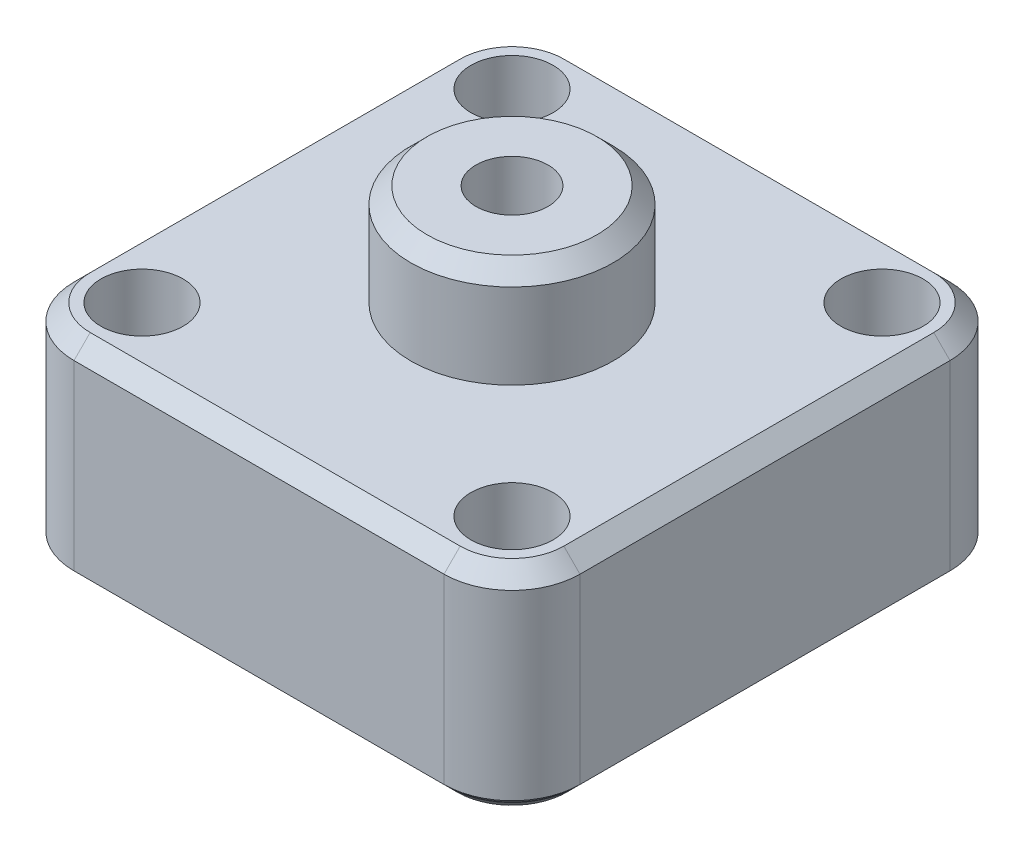
ISO-10303-21;
HEADER;
FILE_DESCRIPTION(('STEP AP214'),'2;1');
FILE_NAME('part.step','',(''),(''),'','','');
FILE_SCHEMA(('AUTOMOTIVE_DESIGN { 1 0 10303 214 1 1 1 1 }'));
ENDSEC;
DATA;
#1=APPLICATION_CONTEXT('core data for automotive mechanical design processes');
#2=APPLICATION_PROTOCOL_DEFINITION('international standard','automotive_design',2000,#1);
#3=PRODUCT_CONTEXT('',#1,'mechanical');
#4=PRODUCT('Part','Part','',(#3));
#5=PRODUCT_RELATED_PRODUCT_CATEGORY('part','',(#4));
#6=PRODUCT_DEFINITION_FORMATION('','',#4);
#7=PRODUCT_DEFINITION_CONTEXT('part definition',#1,'design');
#8=PRODUCT_DEFINITION('design','',#6,#7);
#9=PRODUCT_DEFINITION_SHAPE('','',#8);
#10=(LENGTH_UNIT() NAMED_UNIT(*) SI_UNIT(.MILLI.,.METRE.));
#11=(NAMED_UNIT(*) PLANE_ANGLE_UNIT() SI_UNIT($,.RADIAN.));
#12=(NAMED_UNIT(*) SI_UNIT($,.STERADIAN.) SOLID_ANGLE_UNIT());
#13=UNCERTAINTY_MEASURE_WITH_UNIT(LENGTH_MEASURE(1.E-05),#10,'distance_accuracy_value','');
#14=(GEOMETRIC_REPRESENTATION_CONTEXT(3) GLOBAL_UNCERTAINTY_ASSIGNED_CONTEXT((#13)) GLOBAL_UNIT_ASSIGNED_CONTEXT((#10,
#11,#12)) REPRESENTATION_CONTEXT('',''));
#15=CARTESIAN_POINT('',(0.,0.,0.));
#16=DIRECTION('',(0.,0.,1.));
#17=DIRECTION('',(1.,0.,0.));
#18=AXIS2_PLACEMENT_3D('',#15,#16,#17);
#19=CARTESIAN_POINT('',(7.93749999999999,9.525,-7.9375));
#20=DIRECTION('',(-1.,0.,0.));
#21=DIRECTION('',(0.,0.,1.));
#22=AXIS2_PLACEMENT_3D('',#19,#20,#21);
#23=PLANE('',#22);
#24=DIRECTION('',(0.,-1.,0.));
#25=VECTOR('',#24,1.);
#26=CARTESIAN_POINT('',(7.9375,9.525,5.8039));
#27=LINE('',#26,#25);
#28=CARTESIAN_POINT('',(7.9375,5.842,5.8039));
#29=VERTEX_POINT('',#28);
#30=CARTESIAN_POINT('',(7.9375,0.127000000000002,5.8039));
#31=VERTEX_POINT('',#30);
#32=EDGE_CURVE('E391',#29,#31,#27,.T.);
#33=ORIENTED_EDGE('',*,*,#32,.T.);
#34=DIRECTION('',(0.,0.,-1.));
#35=VECTOR('',#34,1.);
#36=CARTESIAN_POINT('',(7.93749999999999,0.126999999999999,-7.9375));
#37=LINE('',#36,#35);
#38=CARTESIAN_POINT('',(7.9375,0.127000000000002,-5.8039));
#39=VERTEX_POINT('',#38);
#40=EDGE_CURVE('E13',#31,#39,#37,.T.);
#41=ORIENTED_EDGE('',*,*,#40,.T.);
#42=DIRECTION('',(0.,-1.,0.));
#43=VECTOR('',#42,1.);
#44=CARTESIAN_POINT('',(7.9375,9.525,-5.8039));
#45=LINE('',#44,#43);
#46=CARTESIAN_POINT('',(7.9375,5.842,-5.8039));
#47=VERTEX_POINT('',#46);
#48=EDGE_CURVE('E389',#47,#39,#45,.T.);
#49=ORIENTED_EDGE('',*,*,#48,.F.);
#50=DIRECTION('',(0.,0.,1.));
#51=VECTOR('',#50,1.);
#52=CARTESIAN_POINT('',(7.9375,5.842,5.8039));
#53=LINE('',#52,#51);
#54=EDGE_CURVE('E385',#47,#29,#53,.T.);
#55=ORIENTED_EDGE('',*,*,#54,.T.);
#56=EDGE_LOOP('',(#33,#41,#49,#55));
#57=FACE_BOUND('',#56,.T.);
#58=ADVANCED_FACE('F44',(#57),#23,.F.);
#59=CARTESIAN_POINT('',(-7.93750000000001,9.525,-7.9375));
#60=DIRECTION('',(0.,0.,1.));
#61=DIRECTION('',(1.,0.,0.));
#62=AXIS2_PLACEMENT_3D('',#59,#60,#61);
#63=PLANE('',#62);
#64=DIRECTION('',(0.,-1.,0.));
#65=VECTOR('',#64,1.);
#66=CARTESIAN_POINT('',(5.8039,9.525,-7.9375));
#67=LINE('',#66,#65);
#68=CARTESIAN_POINT('',(5.8039,5.842,-7.9375));
#69=VERTEX_POINT('',#68);
#70=CARTESIAN_POINT('',(5.8039,0.127000000000002,-7.9375));
#71=VERTEX_POINT('',#70);
#72=EDGE_CURVE('E308',#69,#71,#67,.T.);
#73=ORIENTED_EDGE('',*,*,#72,.T.);
#74=DIRECTION('',(-1.,0.,0.));
#75=VECTOR('',#74,1.);
#76=CARTESIAN_POINT('',(-7.93750000000001,0.126999999999999,-7.9375));
#77=LINE('',#76,#75);
#78=CARTESIAN_POINT('',(-5.8039,0.127000000000002,-7.9375));
#79=VERTEX_POINT('',#78);
#80=EDGE_CURVE('E225',#71,#79,#77,.T.);
#81=ORIENTED_EDGE('',*,*,#80,.T.);
#82=DIRECTION('',(0.,-1.,0.));
#83=VECTOR('',#82,1.);
#84=CARTESIAN_POINT('',(-5.8039,9.525,-7.9375));
#85=LINE('',#84,#83);
#86=CARTESIAN_POINT('',(-5.8039,5.842,-7.9375));
#87=VERTEX_POINT('',#86);
#88=EDGE_CURVE('E306',#87,#79,#85,.T.);
#89=ORIENTED_EDGE('',*,*,#88,.F.);
#90=DIRECTION('',(1.,0.,0.));
#91=VECTOR('',#90,1.);
#92=CARTESIAN_POINT('',(5.8039,5.842,-7.9375));
#93=LINE('',#92,#91);
#94=EDGE_CURVE('E275',#87,#69,#93,.T.);
#95=ORIENTED_EDGE('',*,*,#94,.T.);
#96=EDGE_LOOP('',(#73,#81,#89,#95));
#97=FACE_BOUND('',#96,.T.);
#98=ADVANCED_FACE('F426',(#97),#63,.F.);
#99=CARTESIAN_POINT('',(-7.93750000000001,9.525,-7.9375));
#100=DIRECTION('',(1.,0.,0.));
#101=DIRECTION('',(0.,0.,-1.));
#102=AXIS2_PLACEMENT_3D('',#99,#100,#101);
#103=PLANE('',#102);
#104=DIRECTION('',(0.,-1.,0.));
#105=VECTOR('',#104,1.);
#106=CARTESIAN_POINT('',(-7.9375,9.525,-5.8039));
#107=LINE('',#106,#105);
#108=CARTESIAN_POINT('',(-7.9375,5.842,-5.8039));
#109=VERTEX_POINT('',#108);
#110=CARTESIAN_POINT('',(-7.9375,0.127000000000002,-5.8039));
#111=VERTEX_POINT('',#110);
#112=EDGE_CURVE('E300',#109,#111,#107,.T.);
#113=ORIENTED_EDGE('',*,*,#112,.T.);
#114=DIRECTION('',(0.,0.,1.));
#115=VECTOR('',#114,1.);
#116=CARTESIAN_POINT('',(-7.93750000000001,0.126999999999999,-7.9375));
#117=LINE('',#116,#115);
#118=CARTESIAN_POINT('',(-7.9375,0.127000000000002,5.8039));
#119=VERTEX_POINT('',#118);
#120=EDGE_CURVE('E197',#111,#119,#117,.T.);
#121=ORIENTED_EDGE('',*,*,#120,.T.);
#122=DIRECTION('',(0.,-1.,0.));
#123=VECTOR('',#122,1.);
#124=CARTESIAN_POINT('',(-7.9375,9.525,5.8039));
#125=LINE('',#124,#123);
#126=CARTESIAN_POINT('',(-7.9375,5.842,5.8039));
#127=VERTEX_POINT('',#126);
#128=EDGE_CURVE('E190',#127,#119,#125,.T.);
#129=ORIENTED_EDGE('',*,*,#128,.F.);
#130=DIRECTION('',(0.,0.,-1.));
#131=VECTOR('',#130,1.);
#132=CARTESIAN_POINT('',(-7.93750000000001,5.842,-5.8039));
#133=LINE('',#132,#131);
#134=EDGE_CURVE('E201',#127,#109,#133,.T.);
#135=ORIENTED_EDGE('',*,*,#134,.T.);
#136=EDGE_LOOP('',(#113,#121,#129,#135));
#137=FACE_BOUND('',#136,.T.);
#138=ADVANCED_FACE('F299',(#137),#103,.F.);
#139=CARTESIAN_POINT('',(-7.9375,9.525,7.9375));
#140=DIRECTION('',(0.,0.,-1.));
#141=DIRECTION('',(-1.,0.,0.));
#142=AXIS2_PLACEMENT_3D('',#139,#140,#141);
#143=PLANE('',#142);
#144=DIRECTION('',(0.,-1.,0.));
#145=VECTOR('',#144,1.);
#146=CARTESIAN_POINT('',(-5.8039,9.525,7.9375));
#147=LINE('',#146,#145);
#148=CARTESIAN_POINT('',(-5.8039,5.842,7.9375));
#149=VERTEX_POINT('',#148);
#150=CARTESIAN_POINT('',(-5.8039,0.127000000000002,7.9375));
#151=VERTEX_POINT('',#150);
#152=EDGE_CURVE('E318',#149,#151,#147,.T.);
#153=ORIENTED_EDGE('',*,*,#152,.T.);
#154=DIRECTION('',(1.,0.,0.));
#155=VECTOR('',#154,1.);
#156=CARTESIAN_POINT('',(-7.9375,0.126999999999999,7.9375));
#157=LINE('',#156,#155);
#158=CARTESIAN_POINT('',(5.8039,0.127000000000002,7.9375));
#159=VERTEX_POINT('',#158);
#160=EDGE_CURVE('E223',#151,#159,#157,.T.);
#161=ORIENTED_EDGE('',*,*,#160,.T.);
#162=DIRECTION('',(0.,-1.,0.));
#163=VECTOR('',#162,1.);
#164=CARTESIAN_POINT('',(5.8039,9.525,7.9375));
#165=LINE('',#164,#163);
#166=CARTESIAN_POINT('',(5.8039,5.842,7.9375));
#167=VERTEX_POINT('',#166);
#168=EDGE_CURVE('E404',#167,#159,#165,.T.);
#169=ORIENTED_EDGE('',*,*,#168,.F.);
#170=DIRECTION('',(-1.,0.,0.));
#171=VECTOR('',#170,1.);
#172=CARTESIAN_POINT('',(-5.8039,5.842,7.9375));
#173=LINE('',#172,#171);
#174=EDGE_CURVE('E281',#167,#149,#173,.T.);
#175=ORIENTED_EDGE('',*,*,#174,.T.);
#176=EDGE_LOOP('',(#153,#161,#169,#175));
#177=FACE_BOUND('',#176,.T.);
#178=ADVANCED_FACE('F408',(#177),#143,.F.);
#179=CARTESIAN_POINT('',(0.,0.,0.));
#180=DIRECTION('',(0.,1.,0.));
#181=DIRECTION('',(0.,0.,1.));
#182=AXIS2_PLACEMENT_3D('',#179,#180,#181);
#183=PLANE('',#182);
#184=CARTESIAN_POINT('',(-5.8039,0.,5.8039));
#185=DIRECTION('',(0.,1.,0.));
#186=DIRECTION('',(0.,0.,1.));
#187=AXIS2_PLACEMENT_3D('',#184,#185,#186);
#188=CIRCLE('',#187,2.0066);
#189=CARTESIAN_POINT('',(-5.8039,0.,7.8105));
#190=VERTEX_POINT('',#189);
#191=CARTESIAN_POINT('',(-7.8105,0.,5.8039));
#192=VERTEX_POINT('',#191);
#193=EDGE_CURVE('E214',#190,#192,#188,.F.);
#194=ORIENTED_EDGE('',*,*,#193,.T.);
#195=DIRECTION('',(0.,0.,-1.));
#196=VECTOR('',#195,1.);
#197=CARTESIAN_POINT('',(-7.8105,0.,0.));
#198=LINE('',#197,#196);
#199=CARTESIAN_POINT('',(-7.8105,0.,-5.8039));
#200=VERTEX_POINT('',#199);
#201=EDGE_CURVE('E216',#192,#200,#198,.T.);
#202=ORIENTED_EDGE('',*,*,#201,.T.);
#203=CARTESIAN_POINT('',(-5.8039,0.,-5.8039));
#204=DIRECTION('',(0.,1.,0.));
#205=DIRECTION('',(0.,0.,1.));
#206=AXIS2_PLACEMENT_3D('',#203,#204,#205);
#207=CIRCLE('',#206,2.0066);
#208=CARTESIAN_POINT('',(-5.8039,0.,-7.8105));
#209=VERTEX_POINT('',#208);
#210=EDGE_CURVE('E212',#200,#209,#207,.F.);
#211=ORIENTED_EDGE('',*,*,#210,.T.);
#212=DIRECTION('',(1.,0.,0.));
#213=VECTOR('',#212,1.);
#214=CARTESIAN_POINT('',(0.,0.,-7.8105));
#215=LINE('',#214,#213);
#216=CARTESIAN_POINT('',(5.8039,0.,-7.8105));
#217=VERTEX_POINT('',#216);
#218=EDGE_CURVE('E208',#209,#217,#215,.T.);
#219=ORIENTED_EDGE('',*,*,#218,.T.);
#220=CARTESIAN_POINT('',(5.8039,0.,-5.8039));
#221=DIRECTION('',(0.,1.,0.));
#222=DIRECTION('',(0.,0.,1.));
#223=AXIS2_PLACEMENT_3D('',#220,#221,#222);
#224=CIRCLE('',#223,2.0066);
#225=CARTESIAN_POINT('',(7.81049999999999,0.,-5.8039));
#226=VERTEX_POINT('',#225);
#227=EDGE_CURVE('E204',#217,#226,#224,.F.);
#228=ORIENTED_EDGE('',*,*,#227,.T.);
#229=DIRECTION('',(0.,0.,1.));
#230=VECTOR('',#229,1.);
#231=CARTESIAN_POINT('',(7.81049999999999,0.,0.));
#232=LINE('',#231,#230);
#233=CARTESIAN_POINT('',(7.8105,0.,5.8039));
#234=VERTEX_POINT('',#233);
#235=EDGE_CURVE('E200',#226,#234,#232,.T.);
#236=ORIENTED_EDGE('',*,*,#235,.T.);
#237=CARTESIAN_POINT('',(5.8039,0.,5.8039));
#238=DIRECTION('',(0.,1.,0.));
#239=DIRECTION('',(0.,0.,1.));
#240=AXIS2_PLACEMENT_3D('',#237,#238,#239);
#241=CIRCLE('',#240,2.0066);
#242=CARTESIAN_POINT('',(5.8039,0.,7.8105));
#243=VERTEX_POINT('',#242);
#244=EDGE_CURVE('E206',#234,#243,#241,.F.);
#245=ORIENTED_EDGE('',*,*,#244,.T.);
#246=DIRECTION('',(-1.,0.,0.));
#247=VECTOR('',#246,1.);
#248=CARTESIAN_POINT('',(0.,0.,7.8105));
#249=LINE('',#248,#247);
#250=EDGE_CURVE('E210',#243,#190,#249,.T.);
#251=ORIENTED_EDGE('',*,*,#250,.T.);
#252=EDGE_LOOP('',(#194,#202,#211,#219,#228,#236,#245,#251));
#253=FACE_BOUND('',#252,.T.);
#254=CARTESIAN_POINT('',(0.,0.,0.));
#255=DIRECTION('',(0.,1.,0.));
#256=DIRECTION('',(0.,0.,1.));
#257=AXIS2_PLACEMENT_3D('',#254,#255,#256);
#258=CIRCLE('',#257,3.937);
#259=CARTESIAN_POINT('',(0.,0.,3.937));
#260=VERTEX_POINT('',#259);
#261=EDGE_CURVE('E349',#260,#260,#258,.F.);
#262=ORIENTED_EDGE('',*,*,#261,.F.);
#263=EDGE_LOOP('',(#262));
#264=FACE_BOUND('',#263,.T.);
#265=CARTESIAN_POINT('',(5.8039,0.,5.8039));
#266=DIRECTION('',(0.,-1.,0.));
#267=DIRECTION('',(0.,0.,-1.));
#268=AXIS2_PLACEMENT_3D('',#265,#266,#267);
#269=CIRCLE('',#268,1.28905);
#270=CARTESIAN_POINT('',(5.8039,0.,4.51485));
#271=VERTEX_POINT('',#270);
#272=EDGE_CURVE('E337',#271,#271,#269,.T.);
#273=ORIENTED_EDGE('',*,*,#272,.F.);
#274=EDGE_LOOP('',(#273));
#275=FACE_BOUND('',#274,.T.);
#276=CARTESIAN_POINT('',(5.8039,0.,-5.8039));
#277=DIRECTION('',(0.,-1.,0.));
#278=DIRECTION('',(0.,0.,-1.));
#279=AXIS2_PLACEMENT_3D('',#276,#277,#278);
#280=CIRCLE('',#279,1.28905);
#281=CARTESIAN_POINT('',(5.8039,0.,-7.09295));
#282=VERTEX_POINT('',#281);
#283=EDGE_CURVE('E340',#282,#282,#280,.T.);
#284=ORIENTED_EDGE('',*,*,#283,.F.);
#285=EDGE_LOOP('',(#284));
#286=FACE_BOUND('',#285,.T.);
#287=CARTESIAN_POINT('',(-5.8039,0.,-5.8039));
#288=DIRECTION('',(0.,-1.,0.));
#289=DIRECTION('',(0.,0.,-1.));
#290=AXIS2_PLACEMENT_3D('',#287,#288,#289);
#291=CIRCLE('',#290,1.28905);
#292=CARTESIAN_POINT('',(-5.8039,0.,-7.09295));
#293=VERTEX_POINT('',#292);
#294=EDGE_CURVE('E343',#293,#293,#291,.T.);
#295=ORIENTED_EDGE('',*,*,#294,.F.);
#296=EDGE_LOOP('',(#295));
#297=FACE_BOUND('',#296,.T.);
#298=CARTESIAN_POINT('',(-5.8039,0.,5.8039));
#299=DIRECTION('',(0.,-1.,0.));
#300=DIRECTION('',(0.,0.,-1.));
#301=AXIS2_PLACEMENT_3D('',#298,#299,#300);
#302=CIRCLE('',#301,1.28905);
#303=CARTESIAN_POINT('',(-5.8039,0.,4.51485));
#304=VERTEX_POINT('',#303);
#305=EDGE_CURVE('E346',#304,#304,#302,.T.);
#306=ORIENTED_EDGE('',*,*,#305,.F.);
#307=EDGE_LOOP('',(#306));
#308=FACE_BOUND('',#307,.T.);
#309=ADVANCED_FACE('F644',(#253,#264,#275,#286,#297,#308),#183,.F.);
#310=CARTESIAN_POINT('',(0.,6.35,0.));
#311=DIRECTION('',(0.,1.,0.));
#312=DIRECTION('',(0.,0.,1.));
#313=AXIS2_PLACEMENT_3D('',#310,#311,#312);
#314=PLANE('',#313);
#315=CARTESIAN_POINT('',(5.8039,6.35,5.8039));
#316=DIRECTION('',(0.,1.,0.));
#317=DIRECTION('',(0.,0.,1.));
#318=AXIS2_PLACEMENT_3D('',#315,#316,#317);
#319=CIRCLE('',#318,1.6256);
#320=CARTESIAN_POINT('',(5.8039,6.35,7.4295));
#321=VERTEX_POINT('',#320);
#322=CARTESIAN_POINT('',(7.4295,6.35,5.8039));
#323=VERTEX_POINT('',#322);
#324=EDGE_CURVE('E378',#321,#323,#319,.T.);
#325=ORIENTED_EDGE('',*,*,#324,.T.);
#326=DIRECTION('',(0.,0.,-1.));
#327=VECTOR('',#326,1.);
#328=CARTESIAN_POINT('',(7.4295,6.35,-5.8039));
#329=LINE('',#328,#327);
#330=CARTESIAN_POINT('',(7.4295,6.35,-5.8039));
#331=VERTEX_POINT('',#330);
#332=EDGE_CURVE('E382',#323,#331,#329,.T.);
#333=ORIENTED_EDGE('',*,*,#332,.T.);
#334=CARTESIAN_POINT('',(5.8039,6.35,-5.8039));
#335=DIRECTION('',(0.,1.,0.));
#336=DIRECTION('',(0.,0.,1.));
#337=AXIS2_PLACEMENT_3D('',#334,#335,#336);
#338=CIRCLE('',#337,1.6256);
#339=CARTESIAN_POINT('',(5.8039,6.35,-7.4295));
#340=VERTEX_POINT('',#339);
#341=EDGE_CURVE('E380',#331,#340,#338,.T.);
#342=ORIENTED_EDGE('',*,*,#341,.T.);
#343=DIRECTION('',(-1.,0.,0.));
#344=VECTOR('',#343,1.);
#345=CARTESIAN_POINT('',(-5.8039,6.35,-7.4295));
#346=LINE('',#345,#344);
#347=CARTESIAN_POINT('',(-5.8039,6.35,-7.4295));
#348=VERTEX_POINT('',#347);
#349=EDGE_CURVE('E166',#340,#348,#346,.T.);
#350=ORIENTED_EDGE('',*,*,#349,.T.);
#351=CARTESIAN_POINT('',(-5.8039,6.35,-5.8039));
#352=DIRECTION('',(0.,1.,0.));
#353=DIRECTION('',(0.,0.,1.));
#354=AXIS2_PLACEMENT_3D('',#351,#352,#353);
#355=CIRCLE('',#354,1.6256);
#356=CARTESIAN_POINT('',(-7.42950000000001,6.35,-5.8039));
#357=VERTEX_POINT('',#356);
#358=EDGE_CURVE('E159',#348,#357,#355,.T.);
#359=ORIENTED_EDGE('',*,*,#358,.T.);
#360=DIRECTION('',(0.,0.,1.));
#361=VECTOR('',#360,1.);
#362=CARTESIAN_POINT('',(-7.42950000000001,6.35,5.8039));
#363=LINE('',#362,#361);
#364=CARTESIAN_POINT('',(-7.42950000000001,6.35,5.8039));
#365=VERTEX_POINT('',#364);
#366=EDGE_CURVE('E163',#357,#365,#363,.T.);
#367=ORIENTED_EDGE('',*,*,#366,.T.);
#368=CARTESIAN_POINT('',(-5.8039,6.35,5.8039));
#369=DIRECTION('',(0.,1.,0.));
#370=DIRECTION('',(0.,0.,1.));
#371=AXIS2_PLACEMENT_3D('',#368,#369,#370);
#372=CIRCLE('',#371,1.6256);
#373=CARTESIAN_POINT('',(-5.8039,6.35,7.4295));
#374=VERTEX_POINT('',#373);
#375=EDGE_CURVE('E172',#365,#374,#372,.T.);
#376=ORIENTED_EDGE('',*,*,#375,.T.);
#377=DIRECTION('',(1.,0.,0.));
#378=VECTOR('',#377,1.);
#379=CARTESIAN_POINT('',(5.8039,6.35,7.4295));
#380=LINE('',#379,#378);
#381=EDGE_CURVE('E171',#374,#321,#380,.T.);
#382=ORIENTED_EDGE('',*,*,#381,.T.);
#383=EDGE_LOOP('',(#325,#333,#342,#350,#359,#367,#376,#382));
#384=FACE_BOUND('',#383,.T.);
#385=CARTESIAN_POINT('',(-5.8039,6.35,5.8039));
#386=DIRECTION('',(0.,1.,0.));
#387=DIRECTION('',(0.,0.,1.));
#388=AXIS2_PLACEMENT_3D('',#385,#386,#387);
#389=CIRCLE('',#388,1.28905);
#390=CARTESIAN_POINT('',(-5.8039,6.35,7.09295));
#391=VERTEX_POINT('',#390);
#392=EDGE_CURVE('E325',#391,#391,#389,.F.);
#393=ORIENTED_EDGE('',*,*,#392,.T.);
#394=EDGE_LOOP('',(#393));
#395=FACE_BOUND('',#394,.T.);
#396=CARTESIAN_POINT('',(-5.8039,6.35,-5.8039));
#397=DIRECTION('',(0.,1.,0.));
#398=DIRECTION('',(0.,0.,1.));
#399=AXIS2_PLACEMENT_3D('',#396,#397,#398);
#400=CIRCLE('',#399,1.28905);
#401=CARTESIAN_POINT('',(-5.8039,6.35,-4.51485));
#402=VERTEX_POINT('',#401);
#403=EDGE_CURVE('E322',#402,#402,#400,.F.);
#404=ORIENTED_EDGE('',*,*,#403,.T.);
#405=EDGE_LOOP('',(#404));
#406=FACE_BOUND('',#405,.T.);
#407=CARTESIAN_POINT('',(5.8039,6.35,-5.8039));
#408=DIRECTION('',(0.,1.,0.));
#409=DIRECTION('',(0.,0.,1.));
#410=AXIS2_PLACEMENT_3D('',#407,#408,#409);
#411=CIRCLE('',#410,1.28905);
#412=CARTESIAN_POINT('',(5.8039,6.35,-4.51485));
#413=VERTEX_POINT('',#412);
#414=EDGE_CURVE('E319',#413,#413,#411,.F.);
#415=ORIENTED_EDGE('',*,*,#414,.T.);
#416=EDGE_LOOP('',(#415));
#417=FACE_BOUND('',#416,.T.);
#418=CARTESIAN_POINT('',(5.8039,6.35,5.8039));
#419=DIRECTION('',(0.,1.,0.));
#420=DIRECTION('',(0.,0.,1.));
#421=AXIS2_PLACEMENT_3D('',#418,#419,#420);
#422=CIRCLE('',#421,1.28905);
#423=CARTESIAN_POINT('',(5.8039,6.35,7.09295));
#424=VERTEX_POINT('',#423);
#425=EDGE_CURVE('E317',#424,#424,#422,.F.);
#426=ORIENTED_EDGE('',*,*,#425,.T.);
#427=EDGE_LOOP('',(#426));
#428=FACE_BOUND('',#427,.T.);
#429=CARTESIAN_POINT('',(0.,6.35,0.));
#430=DIRECTION('',(0.,1.,0.));
#431=DIRECTION('',(0.,0.,1.));
#432=AXIS2_PLACEMENT_3D('',#429,#430,#431);
#433=CIRCLE('',#432,3.175);
#434=CARTESIAN_POINT('',(0.,6.35,3.175));
#435=VERTEX_POINT('',#434);
#436=EDGE_CURVE('E313',#435,#435,#433,.F.);
#437=ORIENTED_EDGE('',*,*,#436,.T.);
#438=EDGE_LOOP('',(#437));
#439=FACE_BOUND('',#438,.T.);
#440=ADVANCED_FACE('F161',(#384,#395,#406,#417,#428,#439),#314,.T.);
#441=CARTESIAN_POINT('',(0.,9.525,0.));
#442=DIRECTION('',(0.,1.,0.));
#443=DIRECTION('',(0.,0.,1.));
#444=AXIS2_PLACEMENT_3D('',#441,#442,#443);
#445=PLANE('',#444);
#446=CARTESIAN_POINT('',(0.,9.525,0.));
#447=DIRECTION('',(0.,1.,0.));
#448=DIRECTION('',(0.,0.,1.));
#449=AXIS2_PLACEMENT_3D('',#446,#447,#448);
#450=CIRCLE('',#449,2.667);
#451=CARTESIAN_POINT('',(0.,9.525,2.667));
#452=VERTEX_POINT('',#451);
#453=EDGE_CURVE('E369',#452,#452,#450,.T.);
#454=ORIENTED_EDGE('',*,*,#453,.T.);
#455=EDGE_LOOP('',(#454));
#456=FACE_BOUND('',#455,.T.);
#457=CARTESIAN_POINT('',(0.,9.525,0.));
#458=DIRECTION('',(0.,-1.,0.));
#459=DIRECTION('',(0.,0.,-1.));
#460=AXIS2_PLACEMENT_3D('',#457,#458,#459);
#461=CIRCLE('',#460,1.1303);
#462=CARTESIAN_POINT('',(0.,9.525,-1.1303));
#463=VERTEX_POINT('',#462);
#464=EDGE_CURVE('E331',#463,#463,#461,.T.);
#465=ORIENTED_EDGE('',*,*,#464,.T.);
#466=EDGE_LOOP('',(#465));
#467=FACE_BOUND('',#466,.T.);
#468=ADVANCED_FACE('F661',(#456,#467),#445,.T.);
#469=CARTESIAN_POINT('',(-5.8039,0.,5.8039));
#470=DIRECTION('',(0.,-1.,0.));
#471=DIRECTION('',(0.,0.,-1.));
#472=AXIS2_PLACEMENT_3D('',#469,#470,#471);
#473=CYLINDRICAL_SURFACE('',#472,1.28905);
#474=ORIENTED_EDGE('',*,*,#305,.T.);
#475=EDGE_LOOP('',(#474));
#476=FACE_BOUND('',#475,.T.);
#477=ORIENTED_EDGE('',*,*,#392,.F.);
#478=EDGE_LOOP('',(#477));
#479=FACE_BOUND('',#478,.T.);
#480=ADVANCED_FACE('F676',(#476,#479),#473,.F.);
#481=CARTESIAN_POINT('',(-5.8039,0.,-5.8039));
#482=DIRECTION('',(0.,-1.,0.));
#483=DIRECTION('',(0.,0.,-1.));
#484=AXIS2_PLACEMENT_3D('',#481,#482,#483);
#485=CYLINDRICAL_SURFACE('',#484,1.28905);
#486=ORIENTED_EDGE('',*,*,#294,.T.);
#487=EDGE_LOOP('',(#486));
#488=FACE_BOUND('',#487,.T.);
#489=ORIENTED_EDGE('',*,*,#403,.F.);
#490=EDGE_LOOP('',(#489));
#491=FACE_BOUND('',#490,.T.);
#492=ADVANCED_FACE('F686',(#488,#491),#485,.F.);
#493=CARTESIAN_POINT('',(5.8039,0.,-5.8039));
#494=DIRECTION('',(0.,-1.,0.));
#495=DIRECTION('',(0.,0.,-1.));
#496=AXIS2_PLACEMENT_3D('',#493,#494,#495);
#497=CYLINDRICAL_SURFACE('',#496,1.28905);
#498=ORIENTED_EDGE('',*,*,#283,.T.);
#499=EDGE_LOOP('',(#498));
#500=FACE_BOUND('',#499,.T.);
#501=ORIENTED_EDGE('',*,*,#414,.F.);
#502=EDGE_LOOP('',(#501));
#503=FACE_BOUND('',#502,.T.);
#504=ADVANCED_FACE('F697',(#500,#503),#497,.F.);
#505=CARTESIAN_POINT('',(5.8039,0.,5.8039));
#506=DIRECTION('',(0.,-1.,0.));
#507=DIRECTION('',(0.,0.,-1.));
#508=AXIS2_PLACEMENT_3D('',#505,#506,#507);
#509=CYLINDRICAL_SURFACE('',#508,1.28905);
#510=ORIENTED_EDGE('',*,*,#272,.T.);
#511=EDGE_LOOP('',(#510));
#512=FACE_BOUND('',#511,.T.);
#513=ORIENTED_EDGE('',*,*,#425,.F.);
#514=EDGE_LOOP('',(#513));
#515=FACE_BOUND('',#514,.T.);
#516=ADVANCED_FACE('F707',(#512,#515),#509,.F.);
#517=CARTESIAN_POINT('',(0.,-1.143,0.));
#518=DIRECTION('',(0.,1.,0.));
#519=DIRECTION('',(0.,0.,1.));
#520=AXIS2_PLACEMENT_3D('',#517,#518,#519);
#521=CYLINDRICAL_SURFACE('',#520,3.937);
#522=CARTESIAN_POINT('',(0.,-0.888999999999999,0.));
#523=DIRECTION('',(0.,-1.,0.));
#524=DIRECTION('',(0.,0.,-1.));
#525=AXIS2_PLACEMENT_3D('',#522,#523,#524);
#526=CIRCLE('',#525,3.937);
#527=CARTESIAN_POINT('',(0.,-0.888999999999999,-3.937));
#528=VERTEX_POINT('',#527);
#529=EDGE_CURVE('E358',#528,#528,#526,.F.);
#530=ORIENTED_EDGE('',*,*,#529,.T.);
#531=EDGE_LOOP('',(#530));
#532=FACE_BOUND('',#531,.T.);
#533=ORIENTED_EDGE('',*,*,#261,.T.);
#534=EDGE_LOOP('',(#533));
#535=FACE_BOUND('',#534,.T.);
#536=ADVANCED_FACE('F717',(#532,#535),#521,.T.);
#537=CARTESIAN_POINT('',(0.,-1.143,0.));
#538=DIRECTION('',(0.,-1.,0.));
#539=DIRECTION('',(0.,0.,-1.));
#540=AXIS2_PLACEMENT_3D('',#537,#538,#539);
#541=PLANE('',#540);
#542=CARTESIAN_POINT('',(0.,-1.143,0.));
#543=DIRECTION('',(0.,-1.,0.));
#544=DIRECTION('',(0.,0.,-1.));
#545=AXIS2_PLACEMENT_3D('',#542,#543,#544);
#546=CIRCLE('',#545,3.683);
#547=CARTESIAN_POINT('',(0.,-1.143,-3.683));
#548=VERTEX_POINT('',#547);
#549=EDGE_CURVE('E353',#548,#548,#546,.T.);
#550=ORIENTED_EDGE('',*,*,#549,.T.);
#551=EDGE_LOOP('',(#550));
#552=FACE_BOUND('',#551,.T.);
#553=CARTESIAN_POINT('',(0.,-1.143,0.));
#554=DIRECTION('',(0.,-1.,0.));
#555=DIRECTION('',(0.,0.,-1.));
#556=AXIS2_PLACEMENT_3D('',#553,#554,#555);
#557=CIRCLE('',#556,1.9685);
#558=CARTESIAN_POINT('',(0.,-1.143,-1.9685));
#559=VERTEX_POINT('',#558);
#560=EDGE_CURVE('E334',#559,#559,#557,.T.);
#561=ORIENTED_EDGE('',*,*,#560,.F.);
#562=EDGE_LOOP('',(#561));
#563=FACE_BOUND('',#562,.T.);
#564=ADVANCED_FACE('F746',(#552,#563),#541,.T.);
#565=CARTESIAN_POINT('',(0.,-17.7597587950629,0.));
#566=DIRECTION('',(0.,1.,0.));
#567=DIRECTION('',(0.,0.,1.));
#568=AXIS2_PLACEMENT_3D('',#565,#566,#567);
#569=CYLINDRICAL_SURFACE('',#568,1.9685);
#570=CARTESIAN_POINT('',(0.,-5.842,0.));
#571=DIRECTION('',(0.,1.,0.));
#572=DIRECTION('',(0.,0.,1.));
#573=AXIS2_PLACEMENT_3D('',#570,#571,#572);
#574=CIRCLE('',#573,1.9685);
#575=CARTESIAN_POINT('',(0.,-5.842,1.9685));
#576=VERTEX_POINT('',#575);
#577=EDGE_CURVE('E361',#576,#576,#574,.T.);
#578=ORIENTED_EDGE('',*,*,#577,.T.);
#579=EDGE_LOOP('',(#578));
#580=FACE_BOUND('',#579,.T.);
#581=ORIENTED_EDGE('',*,*,#560,.T.);
#582=EDGE_LOOP('',(#581));
#583=FACE_BOUND('',#582,.T.);
#584=ADVANCED_FACE('F736',(#580,#583),#569,.T.);
#585=CARTESIAN_POINT('',(0.,-6.096,0.));
#586=DIRECTION('',(0.,1.,0.));
#587=DIRECTION('',(0.,0.,1.));
#588=AXIS2_PLACEMENT_3D('',#585,#586,#587);
#589=PLANE('',#588);
#590=CARTESIAN_POINT('',(0.,-6.096,0.));
#591=DIRECTION('',(0.,1.,0.));
#592=DIRECTION('',(0.,0.,1.));
#593=AXIS2_PLACEMENT_3D('',#590,#591,#592);
#594=CIRCLE('',#593,1.7145);
#595=CARTESIAN_POINT('',(0.,-6.096,1.7145));
#596=VERTEX_POINT('',#595);
#597=EDGE_CURVE('E365',#596,#596,#594,.F.);
#598=ORIENTED_EDGE('',*,*,#597,.T.);
#599=EDGE_LOOP('',(#598));
#600=FACE_BOUND('',#599,.T.);
#601=CARTESIAN_POINT('',(0.,-6.096,0.));
#602=DIRECTION('',(0.,-1.,0.));
#603=DIRECTION('',(0.,0.,-1.));
#604=AXIS2_PLACEMENT_3D('',#601,#602,#603);
#605=CIRCLE('',#604,1.1303);
#606=CARTESIAN_POINT('',(0.,-6.096,-1.1303));
#607=VERTEX_POINT('',#606);
#608=EDGE_CURVE('E328',#607,#607,#605,.T.);
#609=ORIENTED_EDGE('',*,*,#608,.F.);
#610=EDGE_LOOP('',(#609));
#611=FACE_BOUND('',#610,.T.);
#612=ADVANCED_FACE('F727',(#600,#611),#589,.F.);
#613=CARTESIAN_POINT('',(0.,-6.096,0.));
#614=DIRECTION('',(0.,-1.,0.));
#615=DIRECTION('',(0.,0.,-1.));
#616=AXIS2_PLACEMENT_3D('',#613,#614,#615);
#617=CYLINDRICAL_SURFACE('',#616,1.1303);
#618=ORIENTED_EDGE('',*,*,#464,.F.);
#619=EDGE_LOOP('',(#618));
#620=FACE_BOUND('',#619,.T.);
#621=ORIENTED_EDGE('',*,*,#608,.T.);
#622=EDGE_LOOP('',(#621));
#623=FACE_BOUND('',#622,.T.);
#624=ADVANCED_FACE('F668',(#620,#623),#617,.F.);
#625=CARTESIAN_POINT('',(0.,-22.6751467056996,0.));
#626=DIRECTION('',(0.,1.,0.));
#627=DIRECTION('',(0.,0.,1.));
#628=AXIS2_PLACEMENT_3D('',#625,#626,#627);
#629=CYLINDRICAL_SURFACE('',#628,3.175);
#630=CARTESIAN_POINT('',(0.,9.01700000000001,0.));
#631=DIRECTION('',(0.,1.,0.));
#632=DIRECTION('',(0.,0.,1.));
#633=AXIS2_PLACEMENT_3D('',#630,#631,#632);
#634=CIRCLE('',#633,3.175);
#635=CARTESIAN_POINT('',(0.,9.017,3.175));
#636=VERTEX_POINT('',#635);
#637=EDGE_CURVE('E184',#636,#636,#634,.F.);
#638=CARTESIAN_POINT('',(0.,9.017,3.175));
#639=CARTESIAN_POINT('',(0.,8.98921875,3.175));
#640=CARTESIAN_POINT('',(0.,8.9614375,3.175));
#641=CARTESIAN_POINT('',(0.,8.90587500000001,3.175));
#642=CARTESIAN_POINT('',(0.,8.87809375000001,3.175));
#643=CARTESIAN_POINT('',(0.,8.82253125000001,3.175));
#644=CARTESIAN_POINT('',(0.,8.79475000000001,3.175));
#645=CARTESIAN_POINT('',(0.,8.7391875,3.175));
#646=CARTESIAN_POINT('',(0.,8.71140625,3.175));
#647=CARTESIAN_POINT('',(0.,8.65584375,3.175));
#648=CARTESIAN_POINT('',(0.,8.6280625,3.175));
#649=CARTESIAN_POINT('',(0.,8.5725,3.175));
#650=CARTESIAN_POINT('',(0.,8.54471875,3.175));
#651=CARTESIAN_POINT('',(0.,8.48915625000001,3.175));
#652=CARTESIAN_POINT('',(0.,8.46137500000001,3.175));
#653=CARTESIAN_POINT('',(0.,8.40581250000001,3.175));
#654=CARTESIAN_POINT('',(0.,8.37803125000001,3.175));
#655=CARTESIAN_POINT('',(0.,8.32246875000001,3.175));
#656=CARTESIAN_POINT('',(0.,8.29468750000001,3.175));
#657=CARTESIAN_POINT('',(0.,8.239125,3.175));
#658=CARTESIAN_POINT('',(0.,8.21134375,3.175));
#659=CARTESIAN_POINT('',(0.,8.15578125000001,3.175));
#660=CARTESIAN_POINT('',(0.,8.12800000000001,3.175));
#661=CARTESIAN_POINT('',(0.,8.0724375,3.175));
#662=CARTESIAN_POINT('',(0.,8.04465625,3.175));
#663=CARTESIAN_POINT('',(0.,7.98909375,3.175));
#664=CARTESIAN_POINT('',(0.,7.9613125,3.175));
#665=CARTESIAN_POINT('',(0.,7.90575,3.175));
#666=CARTESIAN_POINT('',(0.,7.87796875,3.175));
#667=CARTESIAN_POINT('',(0.,7.82240625,3.175));
#668=CARTESIAN_POINT('',(0.,7.794625,3.175));
#669=CARTESIAN_POINT('',(0.,7.7390625,3.175));
#670=CARTESIAN_POINT('',(0.,7.71128125,3.175));
#671=CARTESIAN_POINT('',(0.,7.65571875,3.175));
#672=CARTESIAN_POINT('',(0.,7.6279375,3.175));
#673=CARTESIAN_POINT('',(0.,7.572375,3.175));
#674=CARTESIAN_POINT('',(0.,7.54459375,3.175));
#675=CARTESIAN_POINT('',(0.,7.48903125,3.175));
#676=CARTESIAN_POINT('',(0.,7.46125,3.175));
#677=CARTESIAN_POINT('',(0.,7.4056875,3.175));
#678=CARTESIAN_POINT('',(0.,7.37790625,3.175));
#679=CARTESIAN_POINT('',(0.,7.32234375,3.175));
#680=CARTESIAN_POINT('',(0.,7.2945625,3.175));
#681=CARTESIAN_POINT('',(0.,7.239,3.175));
#682=CARTESIAN_POINT('',(0.,7.21121875,3.175));
#683=CARTESIAN_POINT('',(0.,7.15565625,3.175));
#684=CARTESIAN_POINT('',(0.,7.127875,3.175));
#685=CARTESIAN_POINT('',(0.,7.0723125,3.175));
#686=CARTESIAN_POINT('',(0.,7.04453125,3.175));
#687=CARTESIAN_POINT('',(0.,6.98896875,3.175));
#688=CARTESIAN_POINT('',(0.,6.9611875,3.175));
#689=CARTESIAN_POINT('',(0.,6.905625,3.175));
#690=CARTESIAN_POINT('',(0.,6.87784375,3.175));
#691=CARTESIAN_POINT('',(0.,6.82228125,3.175));
#692=CARTESIAN_POINT('',(0.,6.7945,3.175));
#693=CARTESIAN_POINT('',(0.,6.7389375,3.175));
#694=CARTESIAN_POINT('',(0.,6.71115625,3.175));
#695=CARTESIAN_POINT('',(0.,6.65559375,3.175));
#696=CARTESIAN_POINT('',(0.,6.6278125,3.175));
#697=CARTESIAN_POINT('',(0.,6.57225,3.175));
#698=CARTESIAN_POINT('',(0.,6.54446875,3.175));
#699=CARTESIAN_POINT('',(0.,6.48890625,3.175));
#700=CARTESIAN_POINT('',(0.,6.461125,3.175));
#701=CARTESIAN_POINT('',(0.,6.4055625,3.175));
#702=CARTESIAN_POINT('',(0.,6.37778125,3.175));
#703=CARTESIAN_POINT('',(0.,6.35,3.175));
#704=B_SPLINE_CURVE_WITH_KNOTS('',3,(#638,#639,#640,#641,#642,#643,#644,#645,#646,#647,#648,
#649,#650,#651,#652,#653,#654,#655,#656,#657,#658,#659,#660,#661,#662,#663,#664,#665,#666,#667,
#668,#669,#670,#671,#672,#673,#674,#675,#676,#677,#678,#679,#680,#681,#682,#683,#684,#685,#686,
#687,#688,#689,#690,#691,#692,#693,#694,#695,#696,#697,#698,#699,#700,#701,#702,#703),
.UNSPECIFIED.,.F.,.F.,(4,2,2,2,2,2,2,2,2,2,2,2,2,2,2,2,2,2,2,2,2,2,2,2,2,2,2,2,2,2,2,2,4),(0.,
0.0833437499999992,0.166687499999998,0.250031249999998,0.333375000000004,0.416718750000003,
0.500062499999999,0.583406249999998,0.666749999999997,0.75009375,0.833437499999999,
0.916781249999998,1.000125,1.08346875,1.1668125,1.25015625,1.3335,1.41684375,1.5001875,
1.58353125,1.666875,1.75021875,1.8335625,1.91690625,2.00025000000001,2.08359375,2.1669375,
2.25028125,2.33362500000001,2.41696875,2.5003125,2.58365625000001,2.66700000000001),.UNSPECIFIED.);
#705=EDGE_CURVE('BSEAM620',#636,#435,#704,.T.);
#706=ORIENTED_EDGE('',*,*,#637,.T.);
#707=ORIENTED_EDGE('',*,*,#436,.F.);
#708=ORIENTED_EDGE('',*,*,#705,.T.);
#709=ORIENTED_EDGE('',*,*,#705,.F.);
#710=EDGE_LOOP('',(#706,#708,#707,#709));
#711=FACE_BOUND('',#710,.T.);
#712=ADVANCED_FACE('F620',(#711),#629,.T.);
#713=CARTESIAN_POINT('',(-5.8039,9.525,-5.8039));
#714=DIRECTION('',(0.,-1.,0.));
#715=DIRECTION('',(0.,0.,-1.));
#716=AXIS2_PLACEMENT_3D('',#713,#714,#715);
#717=CYLINDRICAL_SURFACE('',#716,2.1336);
#718=ORIENTED_EDGE('',*,*,#88,.T.);
#719=CARTESIAN_POINT('',(-5.8039,0.126999999999999,-5.8039));
#720=DIRECTION('',(0.,1.,0.));
#721=DIRECTION('',(0.,0.,1.));
#722=AXIS2_PLACEMENT_3D('',#719,#720,#721);
#723=CIRCLE('',#722,2.1336);
#724=EDGE_CURVE('E221',#79,#111,#723,.T.);
#725=ORIENTED_EDGE('',*,*,#724,.T.);
#726=ORIENTED_EDGE('',*,*,#112,.F.);
#727=CARTESIAN_POINT('',(-5.8039,5.842,-5.8039));
#728=DIRECTION('',(0.,1.,0.));
#729=DIRECTION('',(0.,0.,1.));
#730=AXIS2_PLACEMENT_3D('',#727,#728,#729);
#731=CIRCLE('',#730,2.1336);
#732=EDGE_CURVE('E187',#109,#87,#731,.F.);
#733=ORIENTED_EDGE('',*,*,#732,.T.);
#734=EDGE_LOOP('',(#718,#725,#726,#733));
#735=FACE_BOUND('',#734,.T.);
#736=ADVANCED_FACE('F304',(#735),#717,.T.);
#737=CARTESIAN_POINT('',(5.8039,9.525,-5.8039));
#738=DIRECTION('',(0.,-1.,0.));
#739=DIRECTION('',(0.,0.,-1.));
#740=AXIS2_PLACEMENT_3D('',#737,#738,#739);
#741=CYLINDRICAL_SURFACE('',#740,2.1336);
#742=ORIENTED_EDGE('',*,*,#48,.T.);
#743=CARTESIAN_POINT('',(5.8039,0.126999999999999,-5.8039));
#744=DIRECTION('',(0.,1.,0.));
#745=DIRECTION('',(0.,0.,1.));
#746=AXIS2_PLACEMENT_3D('',#743,#744,#745);
#747=CIRCLE('',#746,2.1336);
#748=EDGE_CURVE('E53',#39,#71,#747,.T.);
#749=ORIENTED_EDGE('',*,*,#748,.T.);
#750=ORIENTED_EDGE('',*,*,#72,.F.);
#751=CARTESIAN_POINT('',(5.8039,5.842,-5.8039));
#752=DIRECTION('',(0.,1.,0.));
#753=DIRECTION('',(0.,0.,1.));
#754=AXIS2_PLACEMENT_3D('',#751,#752,#753);
#755=CIRCLE('',#754,2.1336);
#756=EDGE_CURVE('E286',#69,#47,#755,.F.);
#757=ORIENTED_EDGE('',*,*,#756,.T.);
#758=EDGE_LOOP('',(#742,#749,#750,#757));
#759=FACE_BOUND('',#758,.T.);
#760=ADVANCED_FACE('F388',(#759),#741,.T.);
#761=CARTESIAN_POINT('',(5.8039,9.525,5.8039));
#762=DIRECTION('',(0.,-1.,0.));
#763=DIRECTION('',(0.,0.,-1.));
#764=AXIS2_PLACEMENT_3D('',#761,#762,#763);
#765=CYLINDRICAL_SURFACE('',#764,2.1336);
#766=ORIENTED_EDGE('',*,*,#168,.T.);
#767=CARTESIAN_POINT('',(5.8039,0.126999999999999,5.8039));
#768=DIRECTION('',(0.,1.,0.));
#769=DIRECTION('',(0.,0.,1.));
#770=AXIS2_PLACEMENT_3D('',#767,#768,#769);
#771=CIRCLE('',#770,2.1336);
#772=EDGE_CURVE('E67',#159,#31,#771,.T.);
#773=ORIENTED_EDGE('',*,*,#772,.T.);
#774=ORIENTED_EDGE('',*,*,#32,.F.);
#775=CARTESIAN_POINT('',(5.8039,5.842,5.8039));
#776=DIRECTION('',(0.,1.,0.));
#777=DIRECTION('',(0.,0.,1.));
#778=AXIS2_PLACEMENT_3D('',#775,#776,#777);
#779=CIRCLE('',#778,2.1336);
#780=EDGE_CURVE('E282',#29,#167,#779,.F.);
#781=ORIENTED_EDGE('',*,*,#780,.T.);
#782=EDGE_LOOP('',(#766,#773,#774,#781));
#783=FACE_BOUND('',#782,.T.);
#784=ADVANCED_FACE('F403',(#783),#765,.T.);
#785=CARTESIAN_POINT('',(-5.8039,9.525,5.8039));
#786=DIRECTION('',(0.,-1.,0.));
#787=DIRECTION('',(0.,0.,-1.));
#788=AXIS2_PLACEMENT_3D('',#785,#786,#787);
#789=CYLINDRICAL_SURFACE('',#788,2.1336);
#790=ORIENTED_EDGE('',*,*,#128,.T.);
#791=CARTESIAN_POINT('',(-5.8039,0.126999999999999,5.8039));
#792=DIRECTION('',(0.,1.,0.));
#793=DIRECTION('',(0.,0.,1.));
#794=AXIS2_PLACEMENT_3D('',#791,#792,#793);
#795=CIRCLE('',#794,2.1336);
#796=EDGE_CURVE('E219',#119,#151,#795,.T.);
#797=ORIENTED_EDGE('',*,*,#796,.T.);
#798=ORIENTED_EDGE('',*,*,#152,.F.);
#799=CARTESIAN_POINT('',(-5.8039,5.842,5.8039));
#800=DIRECTION('',(0.,1.,0.));
#801=DIRECTION('',(0.,0.,1.));
#802=AXIS2_PLACEMENT_3D('',#799,#800,#801);
#803=CIRCLE('',#802,2.1336);
#804=EDGE_CURVE('E290',#149,#127,#803,.F.);
#805=ORIENTED_EDGE('',*,*,#804,.T.);
#806=EDGE_LOOP('',(#790,#797,#798,#805));
#807=FACE_BOUND('',#806,.T.);
#808=ADVANCED_FACE('F439',(#807),#789,.T.);
#809=CARTESIAN_POINT('',(0.,-1.143,0.));
#810=DIRECTION('',(0.,1.,0.));
#811=DIRECTION('',(0.,0.,1.));
#812=AXIS2_PLACEMENT_3D('',#809,#810,#811);
#813=CONICAL_SURFACE('',#812,3.683,0.785398163397455);
#814=ORIENTED_EDGE('',*,*,#529,.F.);
#815=EDGE_LOOP('',(#814));
#816=FACE_BOUND('',#815,.T.);
#817=ORIENTED_EDGE('',*,*,#549,.F.);
#818=EDGE_LOOP('',(#817));
#819=FACE_BOUND('',#818,.T.);
#820=ADVANCED_FACE('F435',(#816,#819),#813,.T.);
#821=CARTESIAN_POINT('',(0.,-5.842,0.));
#822=DIRECTION('',(0.,1.,0.));
#823=DIRECTION('',(0.,0.,1.));
#824=AXIS2_PLACEMENT_3D('',#821,#822,#823);
#825=CONICAL_SURFACE('',#824,1.9685,0.785398163397438);
#826=ORIENTED_EDGE('',*,*,#597,.F.);
#827=EDGE_LOOP('',(#826));
#828=FACE_BOUND('',#827,.T.);
#829=ORIENTED_EDGE('',*,*,#577,.F.);
#830=EDGE_LOOP('',(#829));
#831=FACE_BOUND('',#830,.T.);
#832=ADVANCED_FACE('F438',(#828,#831),#825,.T.);
#833=CARTESIAN_POINT('',(0.,9.525,0.));
#834=DIRECTION('',(0.,-1.,0.));
#835=DIRECTION('',(0.,0.,-1.));
#836=AXIS2_PLACEMENT_3D('',#833,#834,#835);
#837=CONICAL_SURFACE('',#836,2.667,0.785398163397458);
#838=ORIENTED_EDGE('',*,*,#637,.F.);
#839=EDGE_LOOP('',(#838));
#840=FACE_BOUND('',#839,.T.);
#841=ORIENTED_EDGE('',*,*,#453,.F.);
#842=EDGE_LOOP('',(#841));
#843=FACE_BOUND('',#842,.T.);
#844=ADVANCED_FACE('F423',(#840,#843),#837,.T.);
#845=CARTESIAN_POINT('',(-7.42950000000001,6.35,0.));
#846=DIRECTION('',(-0.70710678118655,0.707106781186544,0.));
#847=DIRECTION('',(0.,0.,-1.));
#848=AXIS2_PLACEMENT_3D('',#845,#846,#847);
#849=PLANE('',#848);
#850=DIRECTION('',(0.707106781186544,0.70710678118655,0.));
#851=VECTOR('',#850,1.);
#852=CARTESIAN_POINT('',(-7.93750000000001,5.842,-5.8039));
#853=LINE('',#852,#851);
#854=EDGE_CURVE('E178',#109,#357,#853,.T.);
#855=ORIENTED_EDGE('',*,*,#854,.F.);
#856=ORIENTED_EDGE('',*,*,#134,.F.);
#857=DIRECTION('',(-0.707106781186544,-0.707106781186551,0.));
#858=VECTOR('',#857,1.);
#859=CARTESIAN_POINT('',(-7.42950000000001,6.35,5.8039));
#860=LINE('',#859,#858);
#861=EDGE_CURVE('E181',#365,#127,#860,.T.);
#862=ORIENTED_EDGE('',*,*,#861,.F.);
#863=ORIENTED_EDGE('',*,*,#366,.F.);
#864=EDGE_LOOP('',(#855,#856,#862,#863));
#865=FACE_BOUND('',#864,.T.);
#866=ADVANCED_FACE('F176',(#865),#849,.T.);
#867=CARTESIAN_POINT('',(-5.8039,6.35,5.8039));
#868=DIRECTION('',(0.,-1.,0.));
#869=DIRECTION('',(0.,0.,-1.));
#870=AXIS2_PLACEMENT_3D('',#867,#868,#869);
#871=CONICAL_SURFACE('',#870,1.6256,0.785398163397445);
#872=ORIENTED_EDGE('',*,*,#861,.T.);
#873=ORIENTED_EDGE('',*,*,#804,.F.);
#874=DIRECTION('',(0.,-0.70710678118655,0.707106781186545));
#875=VECTOR('',#874,1.);
#876=CARTESIAN_POINT('',(-5.8039,6.35,7.4295));
#877=LINE('',#876,#875);
#878=EDGE_CURVE('E188',#374,#149,#877,.T.);
#879=ORIENTED_EDGE('',*,*,#878,.F.);
#880=ORIENTED_EDGE('',*,*,#375,.F.);
#881=EDGE_LOOP('',(#872,#873,#879,#880));
#882=FACE_BOUND('',#881,.T.);
#883=ADVANCED_FACE('F415',(#882),#871,.T.);
#884=CARTESIAN_POINT('',(-5.8039,6.35,-5.8039));
#885=DIRECTION('',(0.,-1.,0.));
#886=DIRECTION('',(0.,0.,-1.));
#887=AXIS2_PLACEMENT_3D('',#884,#885,#886);
#888=CONICAL_SURFACE('',#887,1.6256,0.785398163397445);
#889=ORIENTED_EDGE('',*,*,#854,.T.);
#890=ORIENTED_EDGE('',*,*,#358,.F.);
#891=DIRECTION('',(0.,0.70710678118655,0.707106781186545));
#892=VECTOR('',#891,1.);
#893=CARTESIAN_POINT('',(-5.8039,5.842,-7.9375));
#894=LINE('',#893,#892);
#895=EDGE_CURVE('E193',#87,#348,#894,.T.);
#896=ORIENTED_EDGE('',*,*,#895,.F.);
#897=ORIENTED_EDGE('',*,*,#732,.F.);
#898=EDGE_LOOP('',(#889,#890,#896,#897));
#899=FACE_BOUND('',#898,.T.);
#900=ADVANCED_FACE('F186',(#899),#888,.T.);
#901=CARTESIAN_POINT('',(0.,6.35,7.4295));
#902=DIRECTION('',(0.,0.707106781186545,0.70710678118655));
#903=DIRECTION('',(-1.,0.,0.));
#904=AXIS2_PLACEMENT_3D('',#901,#902,#903);
#905=PLANE('',#904);
#906=ORIENTED_EDGE('',*,*,#878,.T.);
#907=ORIENTED_EDGE('',*,*,#174,.F.);
#908=DIRECTION('',(0.,-0.70710678118655,0.707106781186545));
#909=VECTOR('',#908,1.);
#910=CARTESIAN_POINT('',(5.8039,6.35,7.4295));
#911=LINE('',#910,#909);
#912=EDGE_CURVE('E269',#321,#167,#911,.T.);
#913=ORIENTED_EDGE('',*,*,#912,.F.);
#914=ORIENTED_EDGE('',*,*,#381,.F.);
#915=EDGE_LOOP('',(#906,#907,#913,#914));
#916=FACE_BOUND('',#915,.T.);
#917=ADVANCED_FACE('F412',(#916),#905,.T.);
#918=CARTESIAN_POINT('',(0.,6.35,-7.4295));
#919=DIRECTION('',(0.,0.707106781186545,-0.70710678118655));
#920=DIRECTION('',(1.,0.,0.));
#921=AXIS2_PLACEMENT_3D('',#918,#919,#920);
#922=PLANE('',#921);
#923=ORIENTED_EDGE('',*,*,#895,.T.);
#924=ORIENTED_EDGE('',*,*,#349,.F.);
#925=DIRECTION('',(0.,0.70710678118655,0.707106781186545));
#926=VECTOR('',#925,1.);
#927=CARTESIAN_POINT('',(5.8039,5.842,-7.9375));
#928=LINE('',#927,#926);
#929=EDGE_CURVE('E262',#69,#340,#928,.T.);
#930=ORIENTED_EDGE('',*,*,#929,.F.);
#931=ORIENTED_EDGE('',*,*,#94,.F.);
#932=EDGE_LOOP('',(#923,#924,#930,#931));
#933=FACE_BOUND('',#932,.T.);
#934=ADVANCED_FACE('F273',(#933),#922,.T.);
#935=CARTESIAN_POINT('',(5.8039,6.35,5.8039));
#936=DIRECTION('',(0.,-1.,0.));
#937=DIRECTION('',(0.,0.,-1.));
#938=AXIS2_PLACEMENT_3D('',#935,#936,#937);
#939=CONICAL_SURFACE('',#938,1.6256,0.785398163397445);
#940=ORIENTED_EDGE('',*,*,#912,.T.);
#941=ORIENTED_EDGE('',*,*,#780,.F.);
#942=DIRECTION('',(0.707106781186545,-0.70710678118655,0.));
#943=VECTOR('',#942,1.);
#944=CARTESIAN_POINT('',(7.4295,6.35,5.8039));
#945=LINE('',#944,#943);
#946=EDGE_CURVE('E255',#323,#29,#945,.T.);
#947=ORIENTED_EDGE('',*,*,#946,.F.);
#948=ORIENTED_EDGE('',*,*,#324,.F.);
#949=EDGE_LOOP('',(#940,#941,#947,#948));
#950=FACE_BOUND('',#949,.T.);
#951=ADVANCED_FACE('F401',(#950),#939,.T.);
#952=CARTESIAN_POINT('',(5.8039,6.35,-5.8039));
#953=DIRECTION('',(0.,-1.,0.));
#954=DIRECTION('',(0.,0.,-1.));
#955=AXIS2_PLACEMENT_3D('',#952,#953,#954);
#956=CONICAL_SURFACE('',#955,1.6256,0.785398163397445);
#957=ORIENTED_EDGE('',*,*,#929,.T.);
#958=ORIENTED_EDGE('',*,*,#341,.F.);
#959=DIRECTION('',(-0.707106781186545,0.70710678118655,0.));
#960=VECTOR('',#959,1.);
#961=CARTESIAN_POINT('',(7.9375,5.842,-5.8039));
#962=LINE('',#961,#960);
#963=EDGE_CURVE('E250',#47,#331,#962,.T.);
#964=ORIENTED_EDGE('',*,*,#963,.F.);
#965=ORIENTED_EDGE('',*,*,#756,.F.);
#966=EDGE_LOOP('',(#957,#958,#964,#965));
#967=FACE_BOUND('',#966,.T.);
#968=ADVANCED_FACE('F396',(#967),#956,.T.);
#969=CARTESIAN_POINT('',(7.4295,6.35,0.));
#970=DIRECTION('',(0.70710678118655,0.707106781186544,0.));
#971=DIRECTION('',(0.,0.,1.));
#972=AXIS2_PLACEMENT_3D('',#969,#970,#971);
#973=PLANE('',#972);
#974=ORIENTED_EDGE('',*,*,#946,.T.);
#975=ORIENTED_EDGE('',*,*,#54,.F.);
#976=ORIENTED_EDGE('',*,*,#963,.T.);
#977=ORIENTED_EDGE('',*,*,#332,.F.);
#978=EDGE_LOOP('',(#974,#975,#976,#977));
#979=FACE_BOUND('',#978,.T.);
#980=ADVANCED_FACE('F393',(#979),#973,.T.);
#981=CARTESIAN_POINT('',(7.93749999999999,0.126999999999999,-7.9375));
#982=DIRECTION('',(-0.707106781186538,0.707106781186557,0.));
#983=DIRECTION('',(0.,0.,-1.));
#984=AXIS2_PLACEMENT_3D('',#981,#982,#983);
#985=PLANE('',#984);
#986=DIRECTION('',(0.70710678118656,0.707106781186535,0.));
#987=VECTOR('',#986,1.);
#988=CARTESIAN_POINT('',(7.8105,0.,5.8039));
#989=LINE('',#988,#987);
#990=EDGE_CURVE('E244',#234,#31,#989,.T.);
#991=ORIENTED_EDGE('',*,*,#990,.F.);
#992=ORIENTED_EDGE('',*,*,#235,.F.);
#993=DIRECTION('',(-0.707106781186557,-0.707106781186538,0.));
#994=VECTOR('',#993,1.);
#995=CARTESIAN_POINT('',(7.93749999999999,0.126999999999999,-5.8039));
#996=LINE('',#995,#994);
#997=EDGE_CURVE('E48',#39,#226,#996,.T.);
#998=ORIENTED_EDGE('',*,*,#997,.F.);
#999=ORIENTED_EDGE('',*,*,#40,.F.);
#1000=EDGE_LOOP('',(#991,#992,#998,#999));
#1001=FACE_BOUND('',#1000,.T.);
#1002=ADVANCED_FACE('F46',(#1001),#985,.F.);
#1003=CARTESIAN_POINT('',(5.8039,0.,-5.8039));
#1004=DIRECTION('',(0.,1.,0.));
#1005=DIRECTION('',(0.,0.,1.));
#1006=AXIS2_PLACEMENT_3D('',#1003,#1004,#1005);
#1007=CONICAL_SURFACE('',#1006,2.0066,0.785398163397462);
#1008=ORIENTED_EDGE('',*,*,#997,.T.);
#1009=ORIENTED_EDGE('',*,*,#227,.F.);
#1010=DIRECTION('',(0.,-0.707106781186538,0.707106781186557));
#1011=VECTOR('',#1010,1.);
#1012=CARTESIAN_POINT('',(5.8039,0.126999999999999,-7.9375));
#1013=LINE('',#1012,#1011);
#1014=EDGE_CURVE('E242',#71,#217,#1013,.T.);
#1015=ORIENTED_EDGE('',*,*,#1014,.F.);
#1016=ORIENTED_EDGE('',*,*,#748,.F.);
#1017=EDGE_LOOP('',(#1008,#1009,#1015,#1016));
#1018=FACE_BOUND('',#1017,.T.);
#1019=ADVANCED_FACE('F481',(#1018),#1007,.T.);
#1020=CARTESIAN_POINT('',(5.8039,0.,5.8039));
#1021=DIRECTION('',(0.,1.,0.));
#1022=DIRECTION('',(0.,0.,1.));
#1023=AXIS2_PLACEMENT_3D('',#1020,#1021,#1022);
#1024=CONICAL_SURFACE('',#1023,2.0066,0.785398163397462);
#1025=ORIENTED_EDGE('',*,*,#990,.T.);
#1026=ORIENTED_EDGE('',*,*,#772,.F.);
#1027=DIRECTION('',(0.,0.707106781186538,0.707106781186557));
#1028=VECTOR('',#1027,1.);
#1029=CARTESIAN_POINT('',(5.8039,0.,7.8105));
#1030=LINE('',#1029,#1028);
#1031=EDGE_CURVE('E239',#243,#159,#1030,.T.);
#1032=ORIENTED_EDGE('',*,*,#1031,.F.);
#1033=ORIENTED_EDGE('',*,*,#244,.F.);
#1034=EDGE_LOOP('',(#1025,#1026,#1032,#1033));
#1035=FACE_BOUND('',#1034,.T.);
#1036=ADVANCED_FACE('F489',(#1035),#1024,.T.);
#1037=CARTESIAN_POINT('',(-7.93750000000001,0.126999999999999,-7.9375));
#1038=DIRECTION('',(0.,0.707106781186557,0.707106781186538));
#1039=DIRECTION('',(-1.,0.,0.));
#1040=AXIS2_PLACEMENT_3D('',#1037,#1038,#1039);
#1041=PLANE('',#1040);
#1042=ORIENTED_EDGE('',*,*,#1014,.T.);
#1043=ORIENTED_EDGE('',*,*,#218,.F.);
#1044=DIRECTION('',(0.,-0.707106781186538,0.707106781186557));
#1045=VECTOR('',#1044,1.);
#1046=CARTESIAN_POINT('',(-5.8039,0.126999999999999,-7.9375));
#1047=LINE('',#1046,#1045);
#1048=EDGE_CURVE('E236',#79,#209,#1047,.T.);
#1049=ORIENTED_EDGE('',*,*,#1048,.F.);
#1050=ORIENTED_EDGE('',*,*,#80,.F.);
#1051=EDGE_LOOP('',(#1042,#1043,#1049,#1050));
#1052=FACE_BOUND('',#1051,.T.);
#1053=ADVANCED_FACE('F495',(#1052),#1041,.F.);
#1054=CARTESIAN_POINT('',(-7.9375,0.126999999999999,7.9375));
#1055=DIRECTION('',(0.,0.707106781186557,-0.707106781186538));
#1056=DIRECTION('',(1.,0.,0.));
#1057=AXIS2_PLACEMENT_3D('',#1054,#1055,#1056);
#1058=PLANE('',#1057);
#1059=ORIENTED_EDGE('',*,*,#1031,.T.);
#1060=ORIENTED_EDGE('',*,*,#160,.F.);
#1061=DIRECTION('',(0.,0.707106781186538,0.707106781186557));
#1062=VECTOR('',#1061,1.);
#1063=CARTESIAN_POINT('',(-5.8039,0.,7.8105));
#1064=LINE('',#1063,#1062);
#1065=EDGE_CURVE('E233',#190,#151,#1064,.T.);
#1066=ORIENTED_EDGE('',*,*,#1065,.F.);
#1067=ORIENTED_EDGE('',*,*,#250,.F.);
#1068=EDGE_LOOP('',(#1059,#1060,#1066,#1067));
#1069=FACE_BOUND('',#1068,.T.);
#1070=ADVANCED_FACE('F502',(#1069),#1058,.F.);
#1071=CARTESIAN_POINT('',(-5.8039,0.,-5.8039));
#1072=DIRECTION('',(0.,1.,0.));
#1073=DIRECTION('',(0.,0.,1.));
#1074=AXIS2_PLACEMENT_3D('',#1071,#1072,#1073);
#1075=CONICAL_SURFACE('',#1074,2.0066,0.785398163397462);
#1076=ORIENTED_EDGE('',*,*,#1048,.T.);
#1077=ORIENTED_EDGE('',*,*,#210,.F.);
#1078=DIRECTION('',(0.707106781186557,-0.707106781186538,0.));
#1079=VECTOR('',#1078,1.);
#1080=CARTESIAN_POINT('',(-7.9375,0.126999999999999,-5.8039));
#1081=LINE('',#1080,#1079);
#1082=EDGE_CURVE('E231',#111,#200,#1081,.T.);
#1083=ORIENTED_EDGE('',*,*,#1082,.F.);
#1084=ORIENTED_EDGE('',*,*,#724,.F.);
#1085=EDGE_LOOP('',(#1076,#1077,#1083,#1084));
#1086=FACE_BOUND('',#1085,.T.);
#1087=ADVANCED_FACE('F510',(#1086),#1075,.T.);
#1088=CARTESIAN_POINT('',(-5.8039,0.,5.8039));
#1089=DIRECTION('',(0.,1.,0.));
#1090=DIRECTION('',(0.,0.,1.));
#1091=AXIS2_PLACEMENT_3D('',#1088,#1089,#1090);
#1092=CONICAL_SURFACE('',#1091,2.0066,0.785398163397462);
#1093=ORIENTED_EDGE('',*,*,#1065,.T.);
#1094=ORIENTED_EDGE('',*,*,#796,.F.);
#1095=DIRECTION('',(-0.707106781186557,0.707106781186538,0.));
#1096=VECTOR('',#1095,1.);
#1097=CARTESIAN_POINT('',(-7.8105,0.,5.8039));
#1098=LINE('',#1097,#1096);
#1099=EDGE_CURVE('E229',#192,#119,#1098,.T.);
#1100=ORIENTED_EDGE('',*,*,#1099,.F.);
#1101=ORIENTED_EDGE('',*,*,#193,.F.);
#1102=EDGE_LOOP('',(#1093,#1094,#1100,#1101));
#1103=FACE_BOUND('',#1102,.T.);
#1104=ADVANCED_FACE('F518',(#1103),#1092,.T.);
#1105=CARTESIAN_POINT('',(-7.93750000000001,0.126999999999999,-7.9375));
#1106=DIRECTION('',(0.707106781186538,0.707106781186557,0.));
#1107=DIRECTION('',(0.,0.,1.));
#1108=AXIS2_PLACEMENT_3D('',#1105,#1106,#1107);
#1109=PLANE('',#1108);
#1110=ORIENTED_EDGE('',*,*,#1082,.T.);
#1111=ORIENTED_EDGE('',*,*,#201,.F.);
#1112=ORIENTED_EDGE('',*,*,#1099,.T.);
#1113=ORIENTED_EDGE('',*,*,#120,.F.);
#1114=EDGE_LOOP('',(#1110,#1111,#1112,#1113));
#1115=FACE_BOUND('',#1114,.T.);
#1116=ADVANCED_FACE('F526',(#1115),#1109,.F.);
#1117=CLOSED_SHELL('',(#58,#98,#138,#178,#309,#440,#468,#480,#492,#504,#516,#536,#564,#584,#612,
#624,#712,#736,#760,#784,#808,#820,#832,#844,#866,#883,#900,#917,#934,#951,#968,#980,#1002,
#1019,#1036,#1053,#1070,#1087,#1104,#1116));
#1118=MANIFOLD_SOLID_BREP('B2',#1117);
#1119=ADVANCED_BREP_SHAPE_REPRESENTATION('',(#18,#1118),#14);
#1120=SHAPE_DEFINITION_REPRESENTATION(#9,#1119);
ENDSEC;
END-ISO-10303-21;
